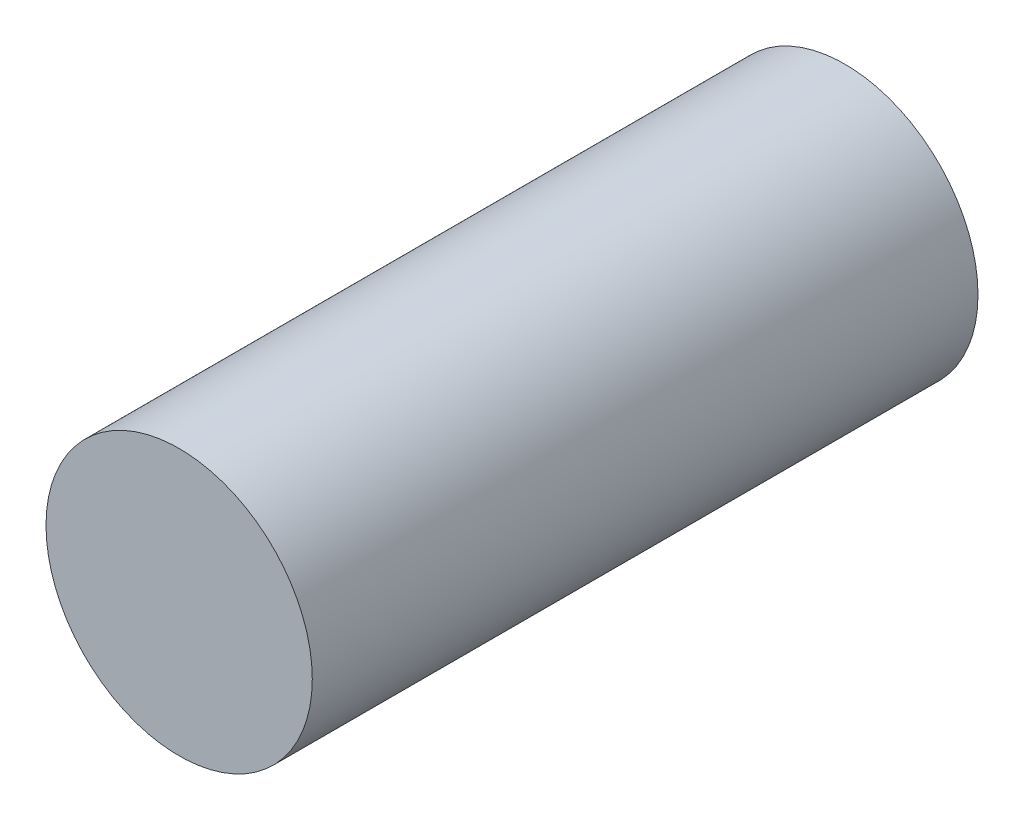
ISO-10303-21;
HEADER;
FILE_DESCRIPTION(('STEP AP214'),'2;1');
FILE_NAME('part.step','',(''),(''),'','','');
FILE_SCHEMA(('AUTOMOTIVE_DESIGN { 1 0 10303 214 1 1 1 1 }'));
ENDSEC;
DATA;
#1=APPLICATION_CONTEXT('core data for automotive mechanical design processes');
#2=APPLICATION_PROTOCOL_DEFINITION('international standard','automotive_design',2000,#1);
#3=PRODUCT_CONTEXT('',#1,'mechanical');
#4=PRODUCT('Part','Part','',(#3));
#5=PRODUCT_RELATED_PRODUCT_CATEGORY('part','',(#4));
#6=PRODUCT_DEFINITION_FORMATION('','',#4);
#7=PRODUCT_DEFINITION_CONTEXT('part definition',#1,'design');
#8=PRODUCT_DEFINITION('design','',#6,#7);
#9=PRODUCT_DEFINITION_SHAPE('','',#8);
#10=(LENGTH_UNIT() NAMED_UNIT(*) SI_UNIT(.MILLI.,.METRE.));
#11=(NAMED_UNIT(*) PLANE_ANGLE_UNIT() SI_UNIT($,.RADIAN.));
#12=(NAMED_UNIT(*) SI_UNIT($,.STERADIAN.) SOLID_ANGLE_UNIT());
#13=UNCERTAINTY_MEASURE_WITH_UNIT(LENGTH_MEASURE(1.E-05),#10,'distance_accuracy_value','');
#14=(GEOMETRIC_REPRESENTATION_CONTEXT(3) GLOBAL_UNCERTAINTY_ASSIGNED_CONTEXT((#13)) GLOBAL_UNIT_ASSIGNED_CONTEXT((#10,
#11,#12)) REPRESENTATION_CONTEXT('',''));
#15=CARTESIAN_POINT('',(0.,0.,0.));
#16=DIRECTION('',(0.,0.,1.));
#17=DIRECTION('',(1.,0.,0.));
#18=AXIS2_PLACEMENT_3D('',#15,#16,#17);
#19=CARTESIAN_POINT('',(0.,0.,30.));
#20=DIRECTION('',(0.,0.,-1.));
#21=DIRECTION('',(-1.,0.,0.));
#22=AXIS2_PLACEMENT_3D('',#19,#20,#21);
#23=CYLINDRICAL_SURFACE('',#22,6.);
#24=CARTESIAN_POINT('',(0.,0.,30.));
#25=DIRECTION('',(0.,0.,1.));
#26=DIRECTION('',(1.,0.,0.));
#27=AXIS2_PLACEMENT_3D('',#24,#25,#26);
#28=CIRCLE('',#27,6.);
#29=CARTESIAN_POINT('',(6.,0.,30.));
#30=VERTEX_POINT('',#29);
#31=EDGE_CURVE('E10',#30,#30,#28,.T.);
#32=ORIENTED_EDGE('',*,*,#31,.F.);
#33=EDGE_LOOP('',(#32));
#34=FACE_BOUND('',#33,.T.);
#35=CARTESIAN_POINT('',(0.,0.,0.));
#36=DIRECTION('',(0.,0.,1.));
#37=DIRECTION('',(1.,0.,0.));
#38=AXIS2_PLACEMENT_3D('',#35,#36,#37);
#39=CIRCLE('',#38,6.);
#40=CARTESIAN_POINT('',(6.,0.,0.));
#41=VERTEX_POINT('',#40);
#42=EDGE_CURVE('E42',#41,#41,#39,.T.);
#43=ORIENTED_EDGE('',*,*,#42,.T.);
#44=EDGE_LOOP('',(#43));
#45=FACE_BOUND('',#44,.T.);
#46=ADVANCED_FACE('F39',(#34,#45),#23,.T.);
#47=CARTESIAN_POINT('',(0.,0.,30.));
#48=DIRECTION('',(0.,0.,1.));
#49=DIRECTION('',(1.,0.,0.));
#50=AXIS2_PLACEMENT_3D('',#47,#48,#49);
#51=PLANE('',#50);
#52=ORIENTED_EDGE('',*,*,#31,.T.);
#53=EDGE_LOOP('',(#52));
#54=FACE_BOUND('',#53,.T.);
#55=ADVANCED_FACE('F54',(#54),#51,.T.);
#56=CARTESIAN_POINT('',(0.,0.,0.));
#57=DIRECTION('',(0.,0.,1.));
#58=DIRECTION('',(1.,0.,0.));
#59=AXIS2_PLACEMENT_3D('',#56,#57,#58);
#60=PLANE('',#59);
#61=ORIENTED_EDGE('',*,*,#42,.F.);
#62=EDGE_LOOP('',(#61));
#63=FACE_BOUND('',#62,.T.);
#64=ADVANCED_FACE('F52',(#63),#60,.F.);
#65=CLOSED_SHELL('',(#46,#55,#64));
#66=MANIFOLD_SOLID_BREP('B2',#65);
#67=ADVANCED_BREP_SHAPE_REPRESENTATION('',(#18,#66),#14);
#68=SHAPE_DEFINITION_REPRESENTATION(#9,#67);
ENDSEC;
END-ISO-10303-21;
